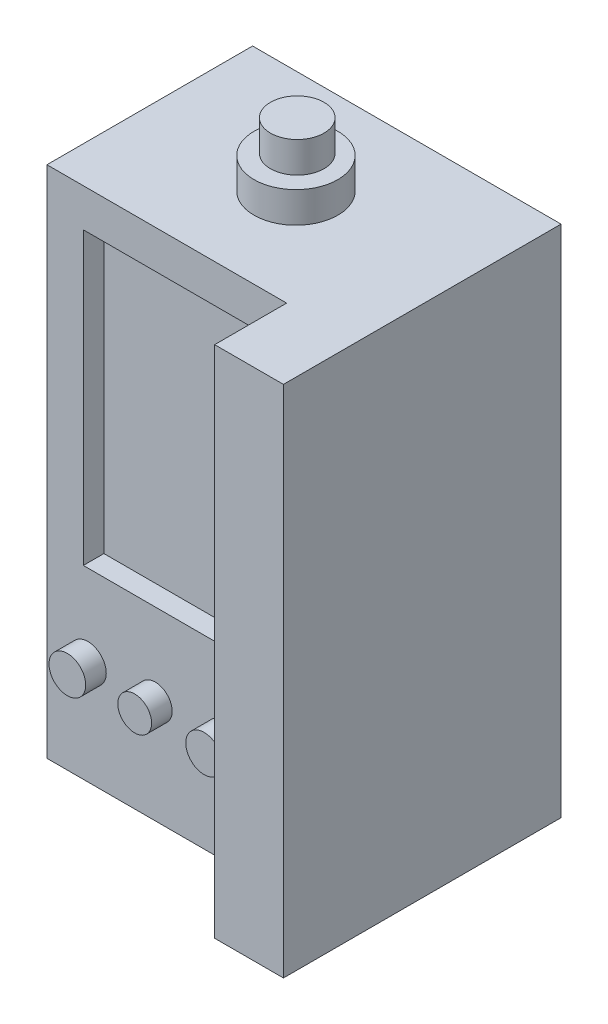
ISO-10303-21;
HEADER;
FILE_DESCRIPTION(('STEP AP214'),'2;1');
FILE_NAME('part.step','',(''),(''),'','','');
FILE_SCHEMA(('AUTOMOTIVE_DESIGN { 1 0 10303 214 1 1 1 1 }'));
ENDSEC;
DATA;
#1=APPLICATION_CONTEXT('core data for automotive mechanical design processes');
#2=APPLICATION_PROTOCOL_DEFINITION('international standard','automotive_design',2000,#1);
#3=PRODUCT_CONTEXT('',#1,'mechanical');
#4=PRODUCT('Part','Part','',(#3));
#5=PRODUCT_RELATED_PRODUCT_CATEGORY('part','',(#4));
#6=PRODUCT_DEFINITION_FORMATION('','',#4);
#7=PRODUCT_DEFINITION_CONTEXT('part definition',#1,'design');
#8=PRODUCT_DEFINITION('design','',#6,#7);
#9=PRODUCT_DEFINITION_SHAPE('','',#8);
#10=(LENGTH_UNIT() NAMED_UNIT(*) SI_UNIT(.MILLI.,.METRE.));
#11=(NAMED_UNIT(*) PLANE_ANGLE_UNIT() SI_UNIT($,.RADIAN.));
#12=(NAMED_UNIT(*) SI_UNIT($,.STERADIAN.) SOLID_ANGLE_UNIT());
#13=UNCERTAINTY_MEASURE_WITH_UNIT(LENGTH_MEASURE(1.E-05),#10,'distance_accuracy_value','');
#14=(GEOMETRIC_REPRESENTATION_CONTEXT(3) GLOBAL_UNCERTAINTY_ASSIGNED_CONTEXT((#13)) GLOBAL_UNIT_ASSIGNED_CONTEXT((#10,
#11,#12)) REPRESENTATION_CONTEXT('',''));
#15=CARTESIAN_POINT('',(0.,0.,0.));
#16=DIRECTION('',(0.,0.,1.));
#17=DIRECTION('',(1.,0.,0.));
#18=AXIS2_PLACEMENT_3D('',#15,#16,#17);
#19=CARTESIAN_POINT('',(-2.79538140352671,33.5591942633084,17.221007175734));
#20=DIRECTION('',(-1.,0.,0.));
#21=DIRECTION('',(0.,-1.,0.));
#22=AXIS2_PLACEMENT_3D('',#19,#20,#21);
#23=PLANE('',#22);
#24=DIRECTION('',(0.,1.,0.));
#25=VECTOR('',#24,1.);
#26=CARTESIAN_POINT('',(-2.79538140352671,33.5591942633084,3.22100717573399));
#27=LINE('',#26,#25);
#28=CARTESIAN_POINT('',(-2.7953814035267,-1.44080573669158,3.22100717573399));
#29=VERTEX_POINT('',#28);
#30=CARTESIAN_POINT('',(-2.79538140352671,33.5591942633084,3.22100717573399));
#31=VERTEX_POINT('',#30);
#32=EDGE_CURVE('E170',#29,#31,#27,.T.);
#33=ORIENTED_EDGE('',*,*,#32,.T.);
#34=DIRECTION('',(0.,0.,-1.));
#35=VECTOR('',#34,1.);
#36=CARTESIAN_POINT('',(-2.79538140352671,33.5591942633084,17.221007175734));
#37=LINE('',#36,#35);
#38=CARTESIAN_POINT('',(-2.79538140352671,33.5591942633084,22.121007175734));
#39=VERTEX_POINT('',#38);
#40=EDGE_CURVE('E42',#39,#31,#37,.T.);
#41=ORIENTED_EDGE('',*,*,#40,.F.);
#42=DIRECTION('',(0.,1.,0.));
#43=VECTOR('',#42,1.);
#44=CARTESIAN_POINT('',(-2.7953814035267,4.80488959279782,22.121007175734));
#45=LINE('',#44,#43);
#46=CARTESIAN_POINT('',(-2.7953814035267,-1.44080573669158,22.121007175734));
#47=VERTEX_POINT('',#46);
#48=EDGE_CURVE('E134',#47,#39,#45,.T.);
#49=ORIENTED_EDGE('',*,*,#48,.F.);
#50=DIRECTION('',(0.,0.,-1.));
#51=VECTOR('',#50,1.);
#52=CARTESIAN_POINT('',(-2.7953814035267,-1.44080573669158,17.221007175734));
#53=LINE('',#52,#51);
#54=EDGE_CURVE('E182',#47,#29,#53,.T.);
#55=ORIENTED_EDGE('',*,*,#54,.T.);
#56=EDGE_LOOP('',(#33,#41,#49,#55));
#57=FACE_BOUND('',#56,.T.);
#58=ADVANCED_FACE('F39',(#57),#23,.F.);
#59=CARTESIAN_POINT('',(-23.7953814035267,33.5591942633084,17.221007175734));
#60=DIRECTION('',(0.,-1.,0.));
#61=DIRECTION('',(0.,0.,-1.));
#62=AXIS2_PLACEMENT_3D('',#59,#60,#61);
#63=PLANE('',#62);
#64=CARTESIAN_POINT('',(-13.767048859401,33.5591942633084,10.2981586443497));
#65=DIRECTION('',(0.,1.,0.));
#66=DIRECTION('',(0.,0.,1.));
#67=AXIS2_PLACEMENT_3D('',#64,#65,#66);
#68=CIRCLE('',#67,2.85205853885435);
#69=CARTESIAN_POINT('',(-13.767048859401,33.5591942633084,13.1502171832041));
#70=VERTEX_POINT('',#69);
#71=EDGE_CURVE('E47',#70,#70,#68,.T.);
#72=ORIENTED_EDGE('',*,*,#71,.F.);
#73=EDGE_LOOP('',(#72));
#74=FACE_BOUND('',#73,.T.);
#75=DIRECTION('',(-1.,0.,0.));
#76=VECTOR('',#75,1.);
#77=CARTESIAN_POINT('',(-23.7953814035267,33.5591942633084,3.22100717573399));
#78=LINE('',#77,#76);
#79=CARTESIAN_POINT('',(-23.7953814035267,33.5591942633084,3.22100717573399));
#80=VERTEX_POINT('',#79);
#81=EDGE_CURVE('E185',#31,#80,#78,.T.);
#82=ORIENTED_EDGE('',*,*,#81,.T.);
#83=DIRECTION('',(0.,0.,-1.));
#84=VECTOR('',#83,1.);
#85=CARTESIAN_POINT('',(-23.7953814035267,33.5591942633084,17.221007175734));
#86=LINE('',#85,#84);
#87=CARTESIAN_POINT('',(-23.7953814035267,33.5591942633084,17.221007175734));
#88=VERTEX_POINT('',#87);
#89=EDGE_CURVE('E194',#88,#80,#86,.T.);
#90=ORIENTED_EDGE('',*,*,#89,.F.);
#91=DIRECTION('',(-1.,0.,0.));
#92=VECTOR('',#91,1.);
#93=CARTESIAN_POINT('',(-23.7953814035267,33.5591942633084,17.221007175734));
#94=LINE('',#93,#92);
#95=CARTESIAN_POINT('',(-7.47893601776985,33.5591942633084,17.221007175734));
#96=VERTEX_POINT('',#95);
#97=EDGE_CURVE('E140',#96,#88,#94,.T.);
#98=ORIENTED_EDGE('',*,*,#97,.F.);
#99=DIRECTION('',(0.,0.,-1.));
#100=VECTOR('',#99,1.);
#101=CARTESIAN_POINT('',(-7.47893601776985,33.5591942633084,22.121007175734));
#102=LINE('',#101,#100);
#103=CARTESIAN_POINT('',(-7.47893601776985,33.5591942633084,22.121007175734));
#104=VERTEX_POINT('',#103);
#105=EDGE_CURVE('E121',#104,#96,#102,.T.);
#106=ORIENTED_EDGE('',*,*,#105,.F.);
#107=DIRECTION('',(-1.,0.,0.));
#108=VECTOR('',#107,1.);
#109=CARTESIAN_POINT('',(-3.79246272769597,33.5591942633084,22.121007175734));
#110=LINE('',#109,#108);
#111=EDGE_CURVE('E128',#39,#104,#110,.T.);
#112=ORIENTED_EDGE('',*,*,#111,.F.);
#113=ORIENTED_EDGE('',*,*,#40,.T.);
#114=EDGE_LOOP('',(#82,#90,#98,#106,#112,#113));
#115=FACE_BOUND('',#114,.T.);
#116=ADVANCED_FACE('F138',(#74,#115),#63,.F.);
#117=CARTESIAN_POINT('',(-23.7953814035267,33.5591942633084,17.221007175734));
#118=DIRECTION('',(1.,0.,0.));
#119=DIRECTION('',(0.,1.,0.));
#120=AXIS2_PLACEMENT_3D('',#117,#118,#119);
#121=PLANE('',#120);
#122=DIRECTION('',(0.,-1.,0.));
#123=VECTOR('',#122,1.);
#124=CARTESIAN_POINT('',(-23.7953814035267,33.5591942633084,3.22100717573399));
#125=LINE('',#124,#123);
#126=CARTESIAN_POINT('',(-23.7953814035267,-1.44080573669158,3.22100717573399));
#127=VERTEX_POINT('',#126);
#128=EDGE_CURVE('E187',#80,#127,#125,.T.);
#129=ORIENTED_EDGE('',*,*,#128,.T.);
#130=DIRECTION('',(0.,0.,-1.));
#131=VECTOR('',#130,1.);
#132=CARTESIAN_POINT('',(-23.7953814035267,-1.44080573669158,17.221007175734));
#133=LINE('',#132,#131);
#134=CARTESIAN_POINT('',(-23.7953814035267,-1.44080573669158,17.221007175734));
#135=VERTEX_POINT('',#134);
#136=EDGE_CURVE('E192',#135,#127,#133,.T.);
#137=ORIENTED_EDGE('',*,*,#136,.F.);
#138=DIRECTION('',(0.,-1.,0.));
#139=VECTOR('',#138,1.);
#140=CARTESIAN_POINT('',(-23.7953814035267,33.5591942633084,17.221007175734));
#141=LINE('',#140,#139);
#142=EDGE_CURVE('E177',#88,#135,#141,.T.);
#143=ORIENTED_EDGE('',*,*,#142,.F.);
#144=ORIENTED_EDGE('',*,*,#89,.T.);
#145=EDGE_LOOP('',(#129,#137,#143,#144));
#146=FACE_BOUND('',#145,.T.);
#147=ADVANCED_FACE('F234',(#146),#121,.F.);
#148=CARTESIAN_POINT('',(-23.7953814035267,-1.44080573669158,17.221007175734));
#149=DIRECTION('',(0.,1.,0.));
#150=DIRECTION('',(0.,0.,1.));
#151=AXIS2_PLACEMENT_3D('',#148,#149,#150);
#152=PLANE('',#151);
#153=DIRECTION('',(1.,0.,0.));
#154=VECTOR('',#153,1.);
#155=CARTESIAN_POINT('',(-23.7953814035267,-1.44080573669158,3.22100717573399));
#156=LINE('',#155,#154);
#157=EDGE_CURVE('E178',#127,#29,#156,.T.);
#158=ORIENTED_EDGE('',*,*,#157,.T.);
#159=ORIENTED_EDGE('',*,*,#54,.F.);
#160=DIRECTION('',(1.,0.,0.));
#161=VECTOR('',#160,1.);
#162=CARTESIAN_POINT('',(-3.79246272769597,-1.44080573669158,22.121007175734));
#163=LINE('',#162,#161);
#164=CARTESIAN_POINT('',(-7.47893601776985,-1.44080573669158,22.121007175734));
#165=VERTEX_POINT('',#164);
#166=EDGE_CURVE('E127',#165,#47,#163,.T.);
#167=ORIENTED_EDGE('',*,*,#166,.F.);
#168=DIRECTION('',(0.,0.,-1.));
#169=VECTOR('',#168,1.);
#170=CARTESIAN_POINT('',(-7.47893601776985,-1.44080573669158,22.121007175734));
#171=LINE('',#170,#169);
#172=CARTESIAN_POINT('',(-7.47893601776985,-1.44080573669158,17.221007175734));
#173=VERTEX_POINT('',#172);
#174=EDGE_CURVE('E123',#165,#173,#171,.T.);
#175=ORIENTED_EDGE('',*,*,#174,.T.);
#176=DIRECTION('',(1.,0.,0.));
#177=VECTOR('',#176,1.);
#178=CARTESIAN_POINT('',(-23.7953814035267,-1.44080573669158,17.221007175734));
#179=LINE('',#178,#177);
#180=EDGE_CURVE('E180',#135,#173,#179,.T.);
#181=ORIENTED_EDGE('',*,*,#180,.F.);
#182=ORIENTED_EDGE('',*,*,#136,.T.);
#183=EDGE_LOOP('',(#158,#159,#167,#175,#181,#182));
#184=FACE_BOUND('',#183,.T.);
#185=ADVANCED_FACE('F227',(#184),#152,.F.);
#186=CARTESIAN_POINT('',(-3.79246272769597,4.80488959279782,17.221007175734));
#187=DIRECTION('',(0.,0.,1.));
#188=DIRECTION('',(1.,0.,0.));
#189=AXIS2_PLACEMENT_3D('',#186,#187,#188);
#190=PLANE('',#189);
#191=CARTESIAN_POINT('',(-11.696623683679,5.59515293267952,17.221007175734));
#192=DIRECTION('',(0.,0.,1.));
#193=DIRECTION('',(1.,0.,0.));
#194=AXIS2_PLACEMENT_3D('',#191,#192,#193);
#195=CIRCLE('',#194,1.2472440046638);
#196=CARTESIAN_POINT('',(-10.4493796790152,5.59515293267952,17.221007175734));
#197=VERTEX_POINT('',#196);
#198=EDGE_CURVE('E210',#197,#197,#195,.T.);
#199=ORIENTED_EDGE('',*,*,#198,.F.);
#200=EDGE_LOOP('',(#199));
#201=FACE_BOUND('',#200,.T.);
#202=CARTESIAN_POINT('',(-16.4216101494022,5.59515293267952,17.221007175734));
#203=DIRECTION('',(0.,0.,1.));
#204=DIRECTION('',(1.,0.,0.));
#205=AXIS2_PLACEMENT_3D('',#202,#203,#204);
#206=CIRCLE('',#205,1.15096971644149);
#207=CARTESIAN_POINT('',(-15.2706404329607,5.59515293267952,17.221007175734));
#208=VERTEX_POINT('',#207);
#209=EDGE_CURVE('E209',#208,#208,#206,.T.);
#210=ORIENTED_EDGE('',*,*,#209,.F.);
#211=EDGE_LOOP('',(#210));
#212=FACE_BOUND('',#211,.T.);
#213=CARTESIAN_POINT('',(-21.0064010664818,5.59515293267952,17.221007175734));
#214=DIRECTION('',(0.,0.,1.));
#215=DIRECTION('',(1.,0.,0.));
#216=AXIS2_PLACEMENT_3D('',#213,#214,#215);
#217=CIRCLE('',#216,1.24837859010856);
#218=CARTESIAN_POINT('',(-19.7580224763732,5.59515293267952,17.221007175734));
#219=VERTEX_POINT('',#218);
#220=EDGE_CURVE('E216',#219,#219,#217,.T.);
#221=ORIENTED_EDGE('',*,*,#220,.F.);
#222=EDGE_LOOP('',(#221));
#223=FACE_BOUND('',#222,.T.);
#224=DIRECTION('',(0.,-1.,0.));
#225=VECTOR('',#224,1.);
#226=CARTESIAN_POINT('',(-7.47893601776985,4.80488959279782,17.221007175734));
#227=LINE('',#226,#225);
#228=EDGE_CURVE('E55',#96,#173,#227,.T.);
#229=ORIENTED_EDGE('',*,*,#228,.F.);
#230=ORIENTED_EDGE('',*,*,#97,.T.);
#231=ORIENTED_EDGE('',*,*,#142,.T.);
#232=ORIENTED_EDGE('',*,*,#180,.T.);
#233=EDGE_LOOP('',(#229,#230,#231,#232));
#234=FACE_BOUND('',#233,.T.);
#235=DIRECTION('',(0.,1.,0.));
#236=VECTOR('',#235,1.);
#237=CARTESIAN_POINT('',(-9.00569416506817,30.9619212226339,17.221007175734));
#238=LINE('',#237,#236);
#239=CARTESIAN_POINT('',(-9.00569416506817,11.171513915197,17.221007175734));
#240=VERTEX_POINT('',#239);
#241=CARTESIAN_POINT('',(-9.00569416506817,30.9619212226339,17.221007175734));
#242=VERTEX_POINT('',#241);
#243=EDGE_CURVE('E63',#240,#242,#238,.T.);
#244=ORIENTED_EDGE('',*,*,#243,.F.);
#245=DIRECTION('',(1.,0.,0.));
#246=VECTOR('',#245,1.);
#247=CARTESIAN_POINT('',(-21.3188164589605,11.171513915197,17.221007175734));
#248=LINE('',#247,#246);
#249=CARTESIAN_POINT('',(-21.3188164589605,11.171513915197,17.221007175734));
#250=VERTEX_POINT('',#249);
#251=EDGE_CURVE('E151',#250,#240,#248,.T.);
#252=ORIENTED_EDGE('',*,*,#251,.F.);
#253=DIRECTION('',(0.,-1.,0.));
#254=VECTOR('',#253,1.);
#255=CARTESIAN_POINT('',(-21.3188164589605,30.9619212226339,17.221007175734));
#256=LINE('',#255,#254);
#257=CARTESIAN_POINT('',(-21.3188164589605,30.9619212226339,17.221007175734));
#258=VERTEX_POINT('',#257);
#259=EDGE_CURVE('E163',#258,#250,#256,.T.);
#260=ORIENTED_EDGE('',*,*,#259,.F.);
#261=DIRECTION('',(-1.,0.,0.));
#262=VECTOR('',#261,1.);
#263=CARTESIAN_POINT('',(-21.3188164589605,30.9619212226339,17.221007175734));
#264=LINE('',#263,#262);
#265=EDGE_CURVE('E142',#242,#258,#264,.T.);
#266=ORIENTED_EDGE('',*,*,#265,.F.);
#267=EDGE_LOOP('',(#244,#252,#260,#266));
#268=FACE_BOUND('',#267,.T.);
#269=ADVANCED_FACE('F235',(#201,#212,#223,#234,#268),#190,.T.);
#270=CARTESIAN_POINT('',(-3.79246272769597,4.80488959279782,3.22100717573399));
#271=DIRECTION('',(0.,0.,1.));
#272=DIRECTION('',(1.,0.,0.));
#273=AXIS2_PLACEMENT_3D('',#270,#271,#272);
#274=PLANE('',#273);
#275=ORIENTED_EDGE('',*,*,#32,.F.);
#276=ORIENTED_EDGE('',*,*,#157,.F.);
#277=ORIENTED_EDGE('',*,*,#128,.F.);
#278=ORIENTED_EDGE('',*,*,#81,.F.);
#279=EDGE_LOOP('',(#275,#276,#277,#278));
#280=FACE_BOUND('',#279,.T.);
#281=ADVANCED_FACE('F232',(#280),#274,.F.);
#282=CARTESIAN_POINT('',(-9.00569416506817,30.9619212226339,15.821007175734));
#283=DIRECTION('',(1.,0.,0.));
#284=DIRECTION('',(0.,0.,-1.));
#285=AXIS2_PLACEMENT_3D('',#282,#283,#284);
#286=PLANE('',#285);
#287=ORIENTED_EDGE('',*,*,#243,.T.);
#288=DIRECTION('',(0.,0.,1.));
#289=VECTOR('',#288,1.);
#290=CARTESIAN_POINT('',(-9.00569416506817,30.9619212226339,15.821007175734));
#291=LINE('',#290,#289);
#292=CARTESIAN_POINT('',(-9.00569416506817,30.9619212226339,15.821007175734));
#293=VERTEX_POINT('',#292);
#294=EDGE_CURVE('E159',#293,#242,#291,.T.);
#295=ORIENTED_EDGE('',*,*,#294,.F.);
#296=DIRECTION('',(0.,1.,0.));
#297=VECTOR('',#296,1.);
#298=CARTESIAN_POINT('',(-9.00569416506817,30.9619212226339,15.821007175734));
#299=LINE('',#298,#297);
#300=CARTESIAN_POINT('',(-9.00569416506817,11.171513915197,15.821007175734));
#301=VERTEX_POINT('',#300);
#302=EDGE_CURVE('E147',#301,#293,#299,.T.);
#303=ORIENTED_EDGE('',*,*,#302,.F.);
#304=DIRECTION('',(0.,0.,1.));
#305=VECTOR('',#304,1.);
#306=CARTESIAN_POINT('',(-9.00569416506817,11.171513915197,15.821007175734));
#307=LINE('',#306,#305);
#308=EDGE_CURVE('E168',#301,#240,#307,.T.);
#309=ORIENTED_EDGE('',*,*,#308,.T.);
#310=EDGE_LOOP('',(#287,#295,#303,#309));
#311=FACE_BOUND('',#310,.T.);
#312=ADVANCED_FACE('F248',(#311),#286,.F.);
#313=CARTESIAN_POINT('',(-21.3188164589605,11.171513915197,15.821007175734));
#314=DIRECTION('',(0.,-1.,0.));
#315=DIRECTION('',(0.,0.,-1.));
#316=AXIS2_PLACEMENT_3D('',#313,#314,#315);
#317=PLANE('',#316);
#318=ORIENTED_EDGE('',*,*,#251,.T.);
#319=ORIENTED_EDGE('',*,*,#308,.F.);
#320=DIRECTION('',(1.,0.,0.));
#321=VECTOR('',#320,1.);
#322=CARTESIAN_POINT('',(-21.3188164589605,11.171513915197,15.821007175734));
#323=LINE('',#322,#321);
#324=CARTESIAN_POINT('',(-21.3188164589605,11.171513915197,15.821007175734));
#325=VERTEX_POINT('',#324);
#326=EDGE_CURVE('E157',#325,#301,#323,.T.);
#327=ORIENTED_EDGE('',*,*,#326,.F.);
#328=DIRECTION('',(0.,0.,1.));
#329=VECTOR('',#328,1.);
#330=CARTESIAN_POINT('',(-21.3188164589605,11.171513915197,15.821007175734));
#331=LINE('',#330,#329);
#332=EDGE_CURVE('E171',#325,#250,#331,.T.);
#333=ORIENTED_EDGE('',*,*,#332,.T.);
#334=EDGE_LOOP('',(#318,#319,#327,#333));
#335=FACE_BOUND('',#334,.T.);
#336=ADVANCED_FACE('F253',(#335),#317,.F.);
#337=CARTESIAN_POINT('',(-21.3188164589605,30.9619212226339,15.821007175734));
#338=DIRECTION('',(-1.,0.,0.));
#339=DIRECTION('',(0.,0.,1.));
#340=AXIS2_PLACEMENT_3D('',#337,#338,#339);
#341=PLANE('',#340);
#342=ORIENTED_EDGE('',*,*,#259,.T.);
#343=ORIENTED_EDGE('',*,*,#332,.F.);
#344=DIRECTION('',(0.,-1.,0.));
#345=VECTOR('',#344,1.);
#346=CARTESIAN_POINT('',(-21.3188164589605,30.9619212226339,15.821007175734));
#347=LINE('',#346,#345);
#348=CARTESIAN_POINT('',(-21.3188164589605,30.9619212226339,15.821007175734));
#349=VERTEX_POINT('',#348);
#350=EDGE_CURVE('E154',#349,#325,#347,.T.);
#351=ORIENTED_EDGE('',*,*,#350,.F.);
#352=DIRECTION('',(0.,0.,1.));
#353=VECTOR('',#352,1.);
#354=CARTESIAN_POINT('',(-21.3188164589605,30.9619212226339,15.821007175734));
#355=LINE('',#354,#353);
#356=EDGE_CURVE('E173',#349,#258,#355,.T.);
#357=ORIENTED_EDGE('',*,*,#356,.T.);
#358=EDGE_LOOP('',(#342,#343,#351,#357));
#359=FACE_BOUND('',#358,.T.);
#360=ADVANCED_FACE('F255',(#359),#341,.F.);
#361=CARTESIAN_POINT('',(-21.3188164589605,30.9619212226339,15.821007175734));
#362=DIRECTION('',(0.,1.,0.));
#363=DIRECTION('',(0.,0.,1.));
#364=AXIS2_PLACEMENT_3D('',#361,#362,#363);
#365=PLANE('',#364);
#366=ORIENTED_EDGE('',*,*,#265,.T.);
#367=ORIENTED_EDGE('',*,*,#356,.F.);
#368=DIRECTION('',(-1.,0.,0.));
#369=VECTOR('',#368,1.);
#370=CARTESIAN_POINT('',(-21.3188164589605,30.9619212226339,15.821007175734));
#371=LINE('',#370,#369);
#372=EDGE_CURVE('E150',#293,#349,#371,.T.);
#373=ORIENTED_EDGE('',*,*,#372,.F.);
#374=ORIENTED_EDGE('',*,*,#294,.T.);
#375=EDGE_LOOP('',(#366,#367,#373,#374));
#376=FACE_BOUND('',#375,.T.);
#377=ADVANCED_FACE('F244',(#376),#365,.F.);
#378=CARTESIAN_POINT('',(-3.79246272769597,4.80488959279782,15.821007175734));
#379=DIRECTION('',(0.,0.,1.));
#380=DIRECTION('',(1.,0.,0.));
#381=AXIS2_PLACEMENT_3D('',#378,#379,#380);
#382=PLANE('',#381);
#383=ORIENTED_EDGE('',*,*,#302,.T.);
#384=ORIENTED_EDGE('',*,*,#372,.T.);
#385=ORIENTED_EDGE('',*,*,#350,.T.);
#386=ORIENTED_EDGE('',*,*,#326,.T.);
#387=EDGE_LOOP('',(#383,#384,#385,#386));
#388=FACE_BOUND('',#387,.T.);
#389=ADVANCED_FACE('F251',(#388),#382,.T.);
#390=CARTESIAN_POINT('',(-7.47893601776985,4.80488959279782,22.121007175734));
#391=DIRECTION('',(1.,0.,0.));
#392=DIRECTION('',(0.,1.,0.));
#393=AXIS2_PLACEMENT_3D('',#390,#391,#392);
#394=PLANE('',#393);
#395=ORIENTED_EDGE('',*,*,#228,.T.);
#396=ORIENTED_EDGE('',*,*,#174,.F.);
#397=DIRECTION('',(0.,-1.,0.));
#398=VECTOR('',#397,1.);
#399=CARTESIAN_POINT('',(-7.47893601776985,4.80488959279782,22.121007175734));
#400=LINE('',#399,#398);
#401=EDGE_CURVE('E117',#104,#165,#400,.T.);
#402=ORIENTED_EDGE('',*,*,#401,.F.);
#403=ORIENTED_EDGE('',*,*,#105,.T.);
#404=EDGE_LOOP('',(#395,#396,#402,#403));
#405=FACE_BOUND('',#404,.T.);
#406=ADVANCED_FACE('F119',(#405),#394,.F.);
#407=CARTESIAN_POINT('',(-3.79246272769597,4.80488959279782,22.121007175734));
#408=DIRECTION('',(0.,0.,1.));
#409=DIRECTION('',(1.,0.,0.));
#410=AXIS2_PLACEMENT_3D('',#407,#408,#409);
#411=PLANE('',#410);
#412=ORIENTED_EDGE('',*,*,#111,.T.);
#413=ORIENTED_EDGE('',*,*,#401,.T.);
#414=ORIENTED_EDGE('',*,*,#166,.T.);
#415=ORIENTED_EDGE('',*,*,#48,.T.);
#416=EDGE_LOOP('',(#412,#413,#414,#415));
#417=FACE_BOUND('',#416,.T.);
#418=ADVANCED_FACE('F132',(#417),#411,.T.);
#419=CARTESIAN_POINT('',(-21.0064010664818,5.59515293267952,18.621007175734));
#420=DIRECTION('',(0.,0.,-1.));
#421=DIRECTION('',(-1.,0.,0.));
#422=AXIS2_PLACEMENT_3D('',#419,#420,#421);
#423=CYLINDRICAL_SURFACE('',#422,1.24837859010856);
#424=CARTESIAN_POINT('',(-21.0064010664818,5.59515293267952,18.621007175734));
#425=DIRECTION('',(0.,0.,1.));
#426=DIRECTION('',(1.,0.,0.));
#427=AXIS2_PLACEMENT_3D('',#424,#425,#426);
#428=CIRCLE('',#427,1.24837859010856);
#429=CARTESIAN_POINT('',(-19.7580224763732,5.59515293267952,18.621007175734));
#430=VERTEX_POINT('',#429);
#431=EDGE_CURVE('E219',#430,#430,#428,.T.);
#432=ORIENTED_EDGE('',*,*,#431,.F.);
#433=EDGE_LOOP('',(#432));
#434=FACE_BOUND('',#433,.T.);
#435=ORIENTED_EDGE('',*,*,#220,.T.);
#436=EDGE_LOOP('',(#435));
#437=FACE_BOUND('',#436,.T.);
#438=ADVANCED_FACE('F324',(#434,#437),#423,.T.);
#439=CARTESIAN_POINT('',(-21.0064010664818,5.59515293267952,18.621007175734));
#440=DIRECTION('',(0.,0.,1.));
#441=DIRECTION('',(1.,0.,0.));
#442=AXIS2_PLACEMENT_3D('',#439,#440,#441);
#443=PLANE('',#442);
#444=ORIENTED_EDGE('',*,*,#431,.T.);
#445=EDGE_LOOP('',(#444));
#446=FACE_BOUND('',#445,.T.);
#447=ADVANCED_FACE('F333',(#446),#443,.T.);
#448=CARTESIAN_POINT('',(-16.4216101494022,5.59515293267952,18.621007175734));
#449=DIRECTION('',(0.,0.,-1.));
#450=DIRECTION('',(-1.,0.,0.));
#451=AXIS2_PLACEMENT_3D('',#448,#449,#450);
#452=CYLINDRICAL_SURFACE('',#451,1.15096971644149);
#453=CARTESIAN_POINT('',(-16.4216101494022,5.59515293267952,18.621007175734));
#454=DIRECTION('',(0.,0.,1.));
#455=DIRECTION('',(1.,0.,0.));
#456=AXIS2_PLACEMENT_3D('',#453,#454,#455);
#457=CIRCLE('',#456,1.15096971644149);
#458=CARTESIAN_POINT('',(-15.2706404329607,5.59515293267952,18.621007175734));
#459=VERTEX_POINT('',#458);
#460=EDGE_CURVE('E213',#459,#459,#457,.T.);
#461=ORIENTED_EDGE('',*,*,#460,.F.);
#462=EDGE_LOOP('',(#461));
#463=FACE_BOUND('',#462,.T.);
#464=ORIENTED_EDGE('',*,*,#209,.T.);
#465=EDGE_LOOP('',(#464));
#466=FACE_BOUND('',#465,.T.);
#467=ADVANCED_FACE('F344',(#463,#466),#452,.T.);
#468=CARTESIAN_POINT('',(-16.4216101494022,5.59515293267952,18.621007175734));
#469=DIRECTION('',(0.,0.,1.));
#470=DIRECTION('',(1.,0.,0.));
#471=AXIS2_PLACEMENT_3D('',#468,#469,#470);
#472=PLANE('',#471);
#473=ORIENTED_EDGE('',*,*,#460,.T.);
#474=EDGE_LOOP('',(#473));
#475=FACE_BOUND('',#474,.T.);
#476=ADVANCED_FACE('F355',(#475),#472,.T.);
#477=CARTESIAN_POINT('',(-11.696623683679,5.59515293267952,18.621007175734));
#478=DIRECTION('',(0.,0.,-1.));
#479=DIRECTION('',(-1.,0.,0.));
#480=AXIS2_PLACEMENT_3D('',#477,#478,#479);
#481=CYLINDRICAL_SURFACE('',#480,1.2472440046638);
#482=CARTESIAN_POINT('',(-11.696623683679,5.59515293267952,18.621007175734));
#483=DIRECTION('',(0.,0.,1.));
#484=DIRECTION('',(1.,0.,0.));
#485=AXIS2_PLACEMENT_3D('',#482,#483,#484);
#486=CIRCLE('',#485,1.2472440046638);
#487=CARTESIAN_POINT('',(-10.4493796790152,5.59515293267952,18.621007175734));
#488=VERTEX_POINT('',#487);
#489=EDGE_CURVE('E206',#488,#488,#486,.T.);
#490=ORIENTED_EDGE('',*,*,#489,.F.);
#491=EDGE_LOOP('',(#490));
#492=FACE_BOUND('',#491,.T.);
#493=ORIENTED_EDGE('',*,*,#198,.T.);
#494=EDGE_LOOP('',(#493));
#495=FACE_BOUND('',#494,.T.);
#496=ADVANCED_FACE('F365',(#492,#495),#481,.T.);
#497=CARTESIAN_POINT('',(-11.696623683679,5.59515293267952,18.621007175734));
#498=DIRECTION('',(0.,0.,1.));
#499=DIRECTION('',(1.,0.,0.));
#500=AXIS2_PLACEMENT_3D('',#497,#498,#499);
#501=PLANE('',#500);
#502=ORIENTED_EDGE('',*,*,#489,.T.);
#503=EDGE_LOOP('',(#502));
#504=FACE_BOUND('',#503,.T.);
#505=ADVANCED_FACE('F374',(#504),#501,.T.);
#506=CARTESIAN_POINT('',(-13.767048859401,35.6591942633084,10.2981586443497));
#507=DIRECTION('',(0.,-1.,0.));
#508=DIRECTION('',(0.,0.,-1.));
#509=AXIS2_PLACEMENT_3D('',#506,#507,#508);
#510=CYLINDRICAL_SURFACE('',#509,2.85205853885435);
#511=CARTESIAN_POINT('',(-13.767048859401,35.6591942633084,10.2981586443497));
#512=DIRECTION('',(0.,1.,0.));
#513=DIRECTION('',(0.,0.,1.));
#514=AXIS2_PLACEMENT_3D('',#511,#512,#513);
#515=CIRCLE('',#514,2.85205853885435);
#516=CARTESIAN_POINT('',(-13.767048859401,35.6591942633084,13.1502171832041));
#517=VERTEX_POINT('',#516);
#518=EDGE_CURVE('E205',#517,#517,#515,.T.);
#519=ORIENTED_EDGE('',*,*,#518,.F.);
#520=EDGE_LOOP('',(#519));
#521=FACE_BOUND('',#520,.T.);
#522=ORIENTED_EDGE('',*,*,#71,.T.);
#523=EDGE_LOOP('',(#522));
#524=FACE_BOUND('',#523,.T.);
#525=ADVANCED_FACE('F384',(#521,#524),#510,.T.);
#526=CARTESIAN_POINT('',(-13.767048859401,35.6591942633084,10.2981586443497));
#527=DIRECTION('',(0.,1.,0.));
#528=DIRECTION('',(0.,0.,1.));
#529=AXIS2_PLACEMENT_3D('',#526,#527,#528);
#530=PLANE('',#529);
#531=CARTESIAN_POINT('',(-13.8479032543169,35.6591942633084,10.1286381127529));
#532=DIRECTION('',(0.,1.,0.));
#533=DIRECTION('',(0.,0.,1.));
#534=AXIS2_PLACEMENT_3D('',#531,#532,#533);
#535=CIRCLE('',#534,1.82119356321451);
#536=CARTESIAN_POINT('',(-13.8479032543169,35.6591942633084,11.9498316759674));
#537=VERTEX_POINT('',#536);
#538=EDGE_CURVE('E11',#537,#537,#535,.T.);
#539=ORIENTED_EDGE('',*,*,#538,.F.);
#540=EDGE_LOOP('',(#539));
#541=FACE_BOUND('',#540,.T.);
#542=ORIENTED_EDGE('',*,*,#518,.T.);
#543=EDGE_LOOP('',(#542));
#544=FACE_BOUND('',#543,.T.);
#545=ADVANCED_FACE('F393',(#541,#544),#530,.T.);
#546=CARTESIAN_POINT('',(-13.8479032543169,37.7591942633084,10.1286381127529));
#547=DIRECTION('',(0.,-1.,0.));
#548=DIRECTION('',(0.,0.,-1.));
#549=AXIS2_PLACEMENT_3D('',#546,#547,#548);
#550=CYLINDRICAL_SURFACE('',#549,1.82119356321451);
#551=CARTESIAN_POINT('',(-13.8479032543169,37.7591942633084,10.1286381127529));
#552=DIRECTION('',(0.,1.,0.));
#553=DIRECTION('',(0.,0.,1.));
#554=AXIS2_PLACEMENT_3D('',#551,#552,#553);
#555=CIRCLE('',#554,1.82119356321451);
#556=CARTESIAN_POINT('',(-13.8479032543169,37.7591942633084,11.9498316759674));
#557=VERTEX_POINT('',#556);
#558=EDGE_CURVE('E429',#557,#557,#555,.T.);
#559=ORIENTED_EDGE('',*,*,#558,.F.);
#560=EDGE_LOOP('',(#559));
#561=FACE_BOUND('',#560,.T.);
#562=ORIENTED_EDGE('',*,*,#538,.T.);
#563=EDGE_LOOP('',(#562));
#564=FACE_BOUND('',#563,.T.);
#565=ADVANCED_FACE('F403',(#561,#564),#550,.T.);
#566=CARTESIAN_POINT('',(-13.8479032543169,37.7591942633084,10.1286381127529));
#567=DIRECTION('',(0.,1.,0.));
#568=DIRECTION('',(0.,0.,1.));
#569=AXIS2_PLACEMENT_3D('',#566,#567,#568);
#570=PLANE('',#569);
#571=ORIENTED_EDGE('',*,*,#558,.T.);
#572=EDGE_LOOP('',(#571));
#573=FACE_BOUND('',#572,.T.);
#574=ADVANCED_FACE('F413',(#573),#570,.T.);
#575=CLOSED_SHELL('',(#58,#116,#147,#185,#269,#281,#312,#336,#360,#377,#389,#406,#418,#438,#447,
#467,#476,#496,#505,#525,#545,#565,#574));
#576=MANIFOLD_SOLID_BREP('B2',#575);
#577=ADVANCED_BREP_SHAPE_REPRESENTATION('',(#18,#576),#14);
#578=SHAPE_DEFINITION_REPRESENTATION(#9,#577);
ENDSEC;
END-ISO-10303-21;
